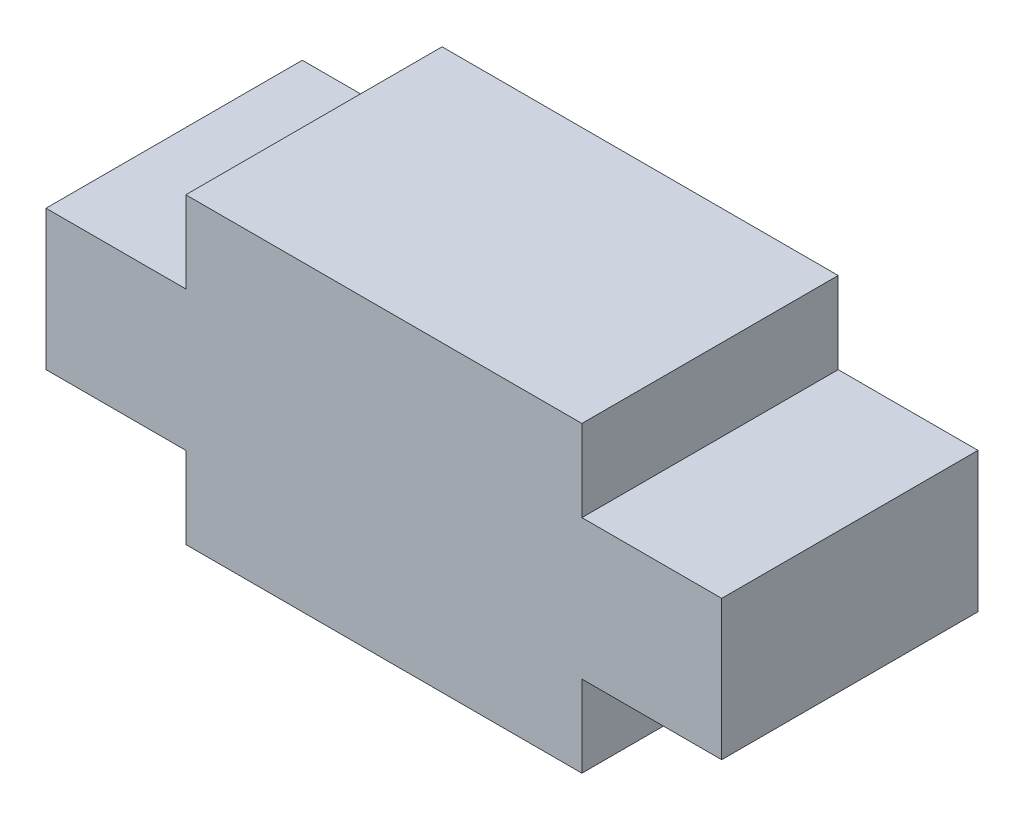
ISO-10303-21;
HEADER;
FILE_DESCRIPTION(('STEP AP214'),'2;1');
FILE_NAME('part.step','',(''),(''),'','','');
FILE_SCHEMA(('AUTOMOTIVE_DESIGN { 1 0 10303 214 1 1 1 1 }'));
ENDSEC;
DATA;
#1=APPLICATION_CONTEXT('core data for automotive mechanical design processes');
#2=APPLICATION_PROTOCOL_DEFINITION('international standard','automotive_design',2000,#1);
#3=PRODUCT_CONTEXT('',#1,'mechanical');
#4=PRODUCT('Part','Part','',(#3));
#5=PRODUCT_RELATED_PRODUCT_CATEGORY('part','',(#4));
#6=PRODUCT_DEFINITION_FORMATION('','',#4);
#7=PRODUCT_DEFINITION_CONTEXT('part definition',#1,'design');
#8=PRODUCT_DEFINITION('design','',#6,#7);
#9=PRODUCT_DEFINITION_SHAPE('','',#8);
#10=(LENGTH_UNIT() NAMED_UNIT(*) SI_UNIT(.MILLI.,.METRE.));
#11=(NAMED_UNIT(*) PLANE_ANGLE_UNIT() SI_UNIT($,.RADIAN.));
#12=(NAMED_UNIT(*) SI_UNIT($,.STERADIAN.) SOLID_ANGLE_UNIT());
#13=UNCERTAINTY_MEASURE_WITH_UNIT(LENGTH_MEASURE(1.E-05),#10,'distance_accuracy_value','');
#14=(GEOMETRIC_REPRESENTATION_CONTEXT(3) GLOBAL_UNCERTAINTY_ASSIGNED_CONTEXT((#13)) GLOBAL_UNIT_ASSIGNED_CONTEXT((#10,
#11,#12)) REPRESENTATION_CONTEXT('',''));
#15=CARTESIAN_POINT('',(0.,0.,0.));
#16=DIRECTION('',(0.,0.,1.));
#17=DIRECTION('',(1.,0.,0.));
#18=AXIS2_PLACEMENT_3D('',#15,#16,#17);
#19=CARTESIAN_POINT('',(-1.45,0.3,1.1));
#20=DIRECTION('',(1.,0.,0.));
#21=DIRECTION('',(0.,0.,-1.));
#22=AXIS2_PLACEMENT_3D('',#19,#20,#21);
#23=PLANE('',#22);
#24=DIRECTION('',(0.,-1.,0.));
#25=VECTOR('',#24,1.);
#26=CARTESIAN_POINT('',(-1.45,0.3,0.));
#27=LINE('',#26,#25);
#28=CARTESIAN_POINT('',(-1.45,0.3,0.));
#29=VERTEX_POINT('',#28);
#30=CARTESIAN_POINT('',(-1.45,-0.3,0.));
#31=VERTEX_POINT('',#30);
#32=EDGE_CURVE('E154',#29,#31,#27,.T.);
#33=ORIENTED_EDGE('',*,*,#32,.T.);
#34=DIRECTION('',(0.,0.,-1.));
#35=VECTOR('',#34,1.);
#36=CARTESIAN_POINT('',(-1.45,-0.3,1.1));
#37=LINE('',#36,#35);
#38=CARTESIAN_POINT('',(-1.45,-0.3,1.1));
#39=VERTEX_POINT('',#38);
#40=EDGE_CURVE('E11',#39,#31,#37,.T.);
#41=ORIENTED_EDGE('',*,*,#40,.F.);
#42=DIRECTION('',(0.,-1.,0.));
#43=VECTOR('',#42,1.);
#44=CARTESIAN_POINT('',(-1.45,0.3,1.1));
#45=LINE('',#44,#43);
#46=CARTESIAN_POINT('',(-1.45,0.3,1.1));
#47=VERTEX_POINT('',#46);
#48=EDGE_CURVE('E176',#47,#39,#45,.T.);
#49=ORIENTED_EDGE('',*,*,#48,.F.);
#50=DIRECTION('',(0.,0.,-1.));
#51=VECTOR('',#50,1.);
#52=CARTESIAN_POINT('',(-1.45,0.3,1.1));
#53=LINE('',#52,#51);
#54=EDGE_CURVE('E150',#47,#29,#53,.T.);
#55=ORIENTED_EDGE('',*,*,#54,.T.);
#56=EDGE_LOOP('',(#33,#41,#49,#55));
#57=FACE_BOUND('',#56,.T.);
#58=ADVANCED_FACE('F34',(#57),#23,.F.);
#59=CARTESIAN_POINT('',(-1.45,-0.3,1.1));
#60=DIRECTION('',(0.,1.,0.));
#61=DIRECTION('',(0.,0.,1.));
#62=AXIS2_PLACEMENT_3D('',#59,#60,#61);
#63=PLANE('',#62);
#64=DIRECTION('',(1.,0.,0.));
#65=VECTOR('',#64,1.);
#66=CARTESIAN_POINT('',(-1.45,-0.3,0.));
#67=LINE('',#66,#65);
#68=CARTESIAN_POINT('',(-0.85,-0.3,0.));
#69=VERTEX_POINT('',#68);
#70=EDGE_CURVE('E157',#31,#69,#67,.T.);
#71=ORIENTED_EDGE('',*,*,#70,.T.);
#72=DIRECTION('',(0.,0.,-1.));
#73=VECTOR('',#72,1.);
#74=CARTESIAN_POINT('',(-0.85,-0.3,1.1));
#75=LINE('',#74,#73);
#76=CARTESIAN_POINT('',(-0.85,-0.3,1.1));
#77=VERTEX_POINT('',#76);
#78=EDGE_CURVE('E42',#77,#69,#75,.T.);
#79=ORIENTED_EDGE('',*,*,#78,.F.);
#80=DIRECTION('',(1.,0.,0.));
#81=VECTOR('',#80,1.);
#82=CARTESIAN_POINT('',(-1.45,-0.3,1.1));
#83=LINE('',#82,#81);
#84=EDGE_CURVE('E105',#39,#77,#83,.T.);
#85=ORIENTED_EDGE('',*,*,#84,.F.);
#86=ORIENTED_EDGE('',*,*,#40,.T.);
#87=EDGE_LOOP('',(#71,#79,#85,#86));
#88=FACE_BOUND('',#87,.T.);
#89=ADVANCED_FACE('F254',(#88),#63,.F.);
#90=CARTESIAN_POINT('',(-0.85,-0.3,1.1));
#91=DIRECTION('',(1.,0.,0.));
#92=DIRECTION('',(0.,0.,-1.));
#93=AXIS2_PLACEMENT_3D('',#90,#91,#92);
#94=PLANE('',#93);
#95=DIRECTION('',(0.,-1.,0.));
#96=VECTOR('',#95,1.);
#97=CARTESIAN_POINT('',(-0.85,-0.3,0.));
#98=LINE('',#97,#96);
#99=CARTESIAN_POINT('',(-0.85,-0.65,0.));
#100=VERTEX_POINT('',#99);
#101=EDGE_CURVE('E159',#69,#100,#98,.T.);
#102=ORIENTED_EDGE('',*,*,#101,.T.);
#103=DIRECTION('',(0.,0.,-1.));
#104=VECTOR('',#103,1.);
#105=CARTESIAN_POINT('',(-0.85,-0.65,1.1));
#106=LINE('',#105,#104);
#107=CARTESIAN_POINT('',(-0.85,-0.65,1.1));
#108=VERTEX_POINT('',#107);
#109=EDGE_CURVE('E195',#108,#100,#106,.T.);
#110=ORIENTED_EDGE('',*,*,#109,.F.);
#111=DIRECTION('',(0.,-1.,0.));
#112=VECTOR('',#111,1.);
#113=CARTESIAN_POINT('',(-0.85,-0.3,1.1));
#114=LINE('',#113,#112);
#115=EDGE_CURVE('E203',#77,#108,#114,.T.);
#116=ORIENTED_EDGE('',*,*,#115,.F.);
#117=ORIENTED_EDGE('',*,*,#78,.T.);
#118=EDGE_LOOP('',(#102,#110,#116,#117));
#119=FACE_BOUND('',#118,.T.);
#120=ADVANCED_FACE('F201',(#119),#94,.F.);
#121=CARTESIAN_POINT('',(-0.85,-0.65,1.1));
#122=DIRECTION('',(0.,1.,0.));
#123=DIRECTION('',(0.,0.,1.));
#124=AXIS2_PLACEMENT_3D('',#121,#122,#123);
#125=PLANE('',#124);
#126=DIRECTION('',(1.,0.,0.));
#127=VECTOR('',#126,1.);
#128=CARTESIAN_POINT('',(-0.85,-0.65,0.));
#129=LINE('',#128,#127);
#130=CARTESIAN_POINT('',(0.85,-0.65,0.));
#131=VERTEX_POINT('',#130);
#132=EDGE_CURVE('E161',#100,#131,#129,.T.);
#133=ORIENTED_EDGE('',*,*,#132,.T.);
#134=DIRECTION('',(0.,0.,-1.));
#135=VECTOR('',#134,1.);
#136=CARTESIAN_POINT('',(0.85,-0.65,1.1));
#137=LINE('',#136,#135);
#138=CARTESIAN_POINT('',(0.85,-0.65,1.1));
#139=VERTEX_POINT('',#138);
#140=EDGE_CURVE('E192',#139,#131,#137,.T.);
#141=ORIENTED_EDGE('',*,*,#140,.F.);
#142=DIRECTION('',(1.,0.,0.));
#143=VECTOR('',#142,1.);
#144=CARTESIAN_POINT('',(-0.85,-0.65,1.1));
#145=LINE('',#144,#143);
#146=EDGE_CURVE('E221',#108,#139,#145,.T.);
#147=ORIENTED_EDGE('',*,*,#146,.F.);
#148=ORIENTED_EDGE('',*,*,#109,.T.);
#149=EDGE_LOOP('',(#133,#141,#147,#148));
#150=FACE_BOUND('',#149,.T.);
#151=ADVANCED_FACE('F212',(#150),#125,.F.);
#152=CARTESIAN_POINT('',(0.85,-0.65,1.1));
#153=DIRECTION('',(-1.,0.,0.));
#154=DIRECTION('',(0.,0.,1.));
#155=AXIS2_PLACEMENT_3D('',#152,#153,#154);
#156=PLANE('',#155);
#157=DIRECTION('',(0.,1.,0.));
#158=VECTOR('',#157,1.);
#159=CARTESIAN_POINT('',(0.85,-0.65,0.));
#160=LINE('',#159,#158);
#161=CARTESIAN_POINT('',(0.85,-0.3,0.));
#162=VERTEX_POINT('',#161);
#163=EDGE_CURVE('E163',#131,#162,#160,.T.);
#164=ORIENTED_EDGE('',*,*,#163,.T.);
#165=DIRECTION('',(0.,0.,-1.));
#166=VECTOR('',#165,1.);
#167=CARTESIAN_POINT('',(0.85,-0.3,1.1));
#168=LINE('',#167,#166);
#169=CARTESIAN_POINT('',(0.85,-0.3,1.1));
#170=VERTEX_POINT('',#169);
#171=EDGE_CURVE('E189',#170,#162,#168,.T.);
#172=ORIENTED_EDGE('',*,*,#171,.F.);
#173=DIRECTION('',(0.,1.,0.));
#174=VECTOR('',#173,1.);
#175=CARTESIAN_POINT('',(0.85,-0.65,1.1));
#176=LINE('',#175,#174);
#177=EDGE_CURVE('E218',#139,#170,#176,.T.);
#178=ORIENTED_EDGE('',*,*,#177,.F.);
#179=ORIENTED_EDGE('',*,*,#140,.T.);
#180=EDGE_LOOP('',(#164,#172,#178,#179));
#181=FACE_BOUND('',#180,.T.);
#182=ADVANCED_FACE('F216',(#181),#156,.F.);
#183=CARTESIAN_POINT('',(0.85,-0.3,1.1));
#184=DIRECTION('',(0.,1.,0.));
#185=DIRECTION('',(0.,0.,1.));
#186=AXIS2_PLACEMENT_3D('',#183,#184,#185);
#187=PLANE('',#186);
#188=DIRECTION('',(1.,0.,0.));
#189=VECTOR('',#188,1.);
#190=CARTESIAN_POINT('',(0.85,-0.3,0.));
#191=LINE('',#190,#189);
#192=CARTESIAN_POINT('',(1.45,-0.3,0.));
#193=VERTEX_POINT('',#192);
#194=EDGE_CURVE('E165',#162,#193,#191,.T.);
#195=ORIENTED_EDGE('',*,*,#194,.T.);
#196=DIRECTION('',(0.,0.,-1.));
#197=VECTOR('',#196,1.);
#198=CARTESIAN_POINT('',(1.45,-0.3,1.1));
#199=LINE('',#198,#197);
#200=CARTESIAN_POINT('',(1.45,-0.3,1.1));
#201=VERTEX_POINT('',#200);
#202=EDGE_CURVE('E186',#201,#193,#199,.T.);
#203=ORIENTED_EDGE('',*,*,#202,.F.);
#204=DIRECTION('',(1.,0.,0.));
#205=VECTOR('',#204,1.);
#206=CARTESIAN_POINT('',(0.85,-0.3,1.1));
#207=LINE('',#206,#205);
#208=EDGE_CURVE('E220',#170,#201,#207,.T.);
#209=ORIENTED_EDGE('',*,*,#208,.F.);
#210=ORIENTED_EDGE('',*,*,#171,.T.);
#211=EDGE_LOOP('',(#195,#203,#209,#210));
#212=FACE_BOUND('',#211,.T.);
#213=ADVANCED_FACE('F267',(#212),#187,.F.);
#214=CARTESIAN_POINT('',(1.45,-0.3,1.1));
#215=DIRECTION('',(-1.,0.,0.));
#216=DIRECTION('',(0.,0.,1.));
#217=AXIS2_PLACEMENT_3D('',#214,#215,#216);
#218=PLANE('',#217);
#219=DIRECTION('',(0.,1.,0.));
#220=VECTOR('',#219,1.);
#221=CARTESIAN_POINT('',(1.45,-0.3,0.));
#222=LINE('',#221,#220);
#223=CARTESIAN_POINT('',(1.45,0.3,0.));
#224=VERTEX_POINT('',#223);
#225=EDGE_CURVE('E167',#193,#224,#222,.T.);
#226=ORIENTED_EDGE('',*,*,#225,.T.);
#227=DIRECTION('',(0.,0.,-1.));
#228=VECTOR('',#227,1.);
#229=CARTESIAN_POINT('',(1.45,0.3,1.1));
#230=LINE('',#229,#228);
#231=CARTESIAN_POINT('',(1.45,0.3,1.1));
#232=VERTEX_POINT('',#231);
#233=EDGE_CURVE('E183',#232,#224,#230,.T.);
#234=ORIENTED_EDGE('',*,*,#233,.F.);
#235=DIRECTION('',(0.,1.,0.));
#236=VECTOR('',#235,1.);
#237=CARTESIAN_POINT('',(1.45,-0.3,1.1));
#238=LINE('',#237,#236);
#239=EDGE_CURVE('E223',#201,#232,#238,.T.);
#240=ORIENTED_EDGE('',*,*,#239,.F.);
#241=ORIENTED_EDGE('',*,*,#202,.T.);
#242=EDGE_LOOP('',(#226,#234,#240,#241));
#243=FACE_BOUND('',#242,.T.);
#244=ADVANCED_FACE('F270',(#243),#218,.F.);
#245=CARTESIAN_POINT('',(1.45,0.3,1.1));
#246=DIRECTION('',(0.,-1.,0.));
#247=DIRECTION('',(0.,0.,-1.));
#248=AXIS2_PLACEMENT_3D('',#245,#246,#247);
#249=PLANE('',#248);
#250=DIRECTION('',(-1.,0.,0.));
#251=VECTOR('',#250,1.);
#252=CARTESIAN_POINT('',(1.45,0.3,0.));
#253=LINE('',#252,#251);
#254=CARTESIAN_POINT('',(0.85,0.3,0.));
#255=VERTEX_POINT('',#254);
#256=EDGE_CURVE('E169',#224,#255,#253,.T.);
#257=ORIENTED_EDGE('',*,*,#256,.T.);
#258=DIRECTION('',(0.,0.,-1.));
#259=VECTOR('',#258,1.);
#260=CARTESIAN_POINT('',(0.85,0.3,1.1));
#261=LINE('',#260,#259);
#262=CARTESIAN_POINT('',(0.85,0.3,1.1));
#263=VERTEX_POINT('',#262);
#264=EDGE_CURVE('E180',#263,#255,#261,.T.);
#265=ORIENTED_EDGE('',*,*,#264,.F.);
#266=DIRECTION('',(-1.,0.,0.));
#267=VECTOR('',#266,1.);
#268=CARTESIAN_POINT('',(1.45,0.3,1.1));
#269=LINE('',#268,#267);
#270=EDGE_CURVE('E229',#232,#263,#269,.T.);
#271=ORIENTED_EDGE('',*,*,#270,.F.);
#272=ORIENTED_EDGE('',*,*,#233,.T.);
#273=EDGE_LOOP('',(#257,#265,#271,#272));
#274=FACE_BOUND('',#273,.T.);
#275=ADVANCED_FACE('F235',(#274),#249,.F.);
#276=CARTESIAN_POINT('',(0.85,0.3,1.1));
#277=DIRECTION('',(-1.,0.,0.));
#278=DIRECTION('',(0.,0.,1.));
#279=AXIS2_PLACEMENT_3D('',#276,#277,#278);
#280=PLANE('',#279);
#281=DIRECTION('',(0.,1.,0.));
#282=VECTOR('',#281,1.);
#283=CARTESIAN_POINT('',(0.85,0.3,0.));
#284=LINE('',#283,#282);
#285=CARTESIAN_POINT('',(0.85,0.65,0.));
#286=VERTEX_POINT('',#285);
#287=EDGE_CURVE('E171',#255,#286,#284,.T.);
#288=ORIENTED_EDGE('',*,*,#287,.T.);
#289=DIRECTION('',(0.,0.,-1.));
#290=VECTOR('',#289,1.);
#291=CARTESIAN_POINT('',(0.85,0.65,1.1));
#292=LINE('',#291,#290);
#293=CARTESIAN_POINT('',(0.85,0.65,1.1));
#294=VERTEX_POINT('',#293);
#295=EDGE_CURVE('E145',#294,#286,#292,.T.);
#296=ORIENTED_EDGE('',*,*,#295,.F.);
#297=DIRECTION('',(0.,1.,0.));
#298=VECTOR('',#297,1.);
#299=CARTESIAN_POINT('',(0.85,0.3,1.1));
#300=LINE('',#299,#298);
#301=EDGE_CURVE('E136',#263,#294,#300,.T.);
#302=ORIENTED_EDGE('',*,*,#301,.F.);
#303=ORIENTED_EDGE('',*,*,#264,.T.);
#304=EDGE_LOOP('',(#288,#296,#302,#303));
#305=FACE_BOUND('',#304,.T.);
#306=ADVANCED_FACE('F239',(#305),#280,.F.);
#307=CARTESIAN_POINT('',(0.85,0.65,1.1));
#308=DIRECTION('',(0.,-1.,0.));
#309=DIRECTION('',(0.,0.,-1.));
#310=AXIS2_PLACEMENT_3D('',#307,#308,#309);
#311=PLANE('',#310);
#312=DIRECTION('',(-1.,0.,0.));
#313=VECTOR('',#312,1.);
#314=CARTESIAN_POINT('',(0.85,0.65,0.));
#315=LINE('',#314,#313);
#316=CARTESIAN_POINT('',(-0.85,0.65,0.));
#317=VERTEX_POINT('',#316);
#318=EDGE_CURVE('E144',#286,#317,#315,.T.);
#319=ORIENTED_EDGE('',*,*,#318,.T.);
#320=DIRECTION('',(0.,0.,-1.));
#321=VECTOR('',#320,1.);
#322=CARTESIAN_POINT('',(-0.85,0.65,1.1));
#323=LINE('',#322,#321);
#324=CARTESIAN_POINT('',(-0.85,0.65,1.1));
#325=VERTEX_POINT('',#324);
#326=EDGE_CURVE('E141',#325,#317,#323,.T.);
#327=ORIENTED_EDGE('',*,*,#326,.F.);
#328=DIRECTION('',(-1.,0.,0.));
#329=VECTOR('',#328,1.);
#330=CARTESIAN_POINT('',(0.85,0.65,1.1));
#331=LINE('',#330,#329);
#332=EDGE_CURVE('E130',#294,#325,#331,.T.);
#333=ORIENTED_EDGE('',*,*,#332,.F.);
#334=ORIENTED_EDGE('',*,*,#295,.T.);
#335=EDGE_LOOP('',(#319,#327,#333,#334));
#336=FACE_BOUND('',#335,.T.);
#337=ADVANCED_FACE('F142',(#336),#311,.F.);
#338=CARTESIAN_POINT('',(-0.85,0.65,1.1));
#339=DIRECTION('',(1.,0.,0.));
#340=DIRECTION('',(0.,0.,-1.));
#341=AXIS2_PLACEMENT_3D('',#338,#339,#340);
#342=PLANE('',#341);
#343=DIRECTION('',(0.,-1.,0.));
#344=VECTOR('',#343,1.);
#345=CARTESIAN_POINT('',(-0.85,0.65,0.));
#346=LINE('',#345,#344);
#347=CARTESIAN_POINT('',(-0.85,0.3,0.));
#348=VERTEX_POINT('',#347);
#349=EDGE_CURVE('E91',#317,#348,#346,.T.);
#350=ORIENTED_EDGE('',*,*,#349,.T.);
#351=DIRECTION('',(0.,0.,-1.));
#352=VECTOR('',#351,1.);
#353=CARTESIAN_POINT('',(-0.85,0.3,1.1));
#354=LINE('',#353,#352);
#355=CARTESIAN_POINT('',(-0.85,0.3,1.1));
#356=VERTEX_POINT('',#355);
#357=EDGE_CURVE('E146',#356,#348,#354,.T.);
#358=ORIENTED_EDGE('',*,*,#357,.F.);
#359=DIRECTION('',(0.,-1.,0.));
#360=VECTOR('',#359,1.);
#361=CARTESIAN_POINT('',(-0.85,0.65,1.1));
#362=LINE('',#361,#360);
#363=EDGE_CURVE('E134',#325,#356,#362,.T.);
#364=ORIENTED_EDGE('',*,*,#363,.F.);
#365=ORIENTED_EDGE('',*,*,#326,.T.);
#366=EDGE_LOOP('',(#350,#358,#364,#365));
#367=FACE_BOUND('',#366,.T.);
#368=ADVANCED_FACE('F148',(#367),#342,.F.);
#369=CARTESIAN_POINT('',(-0.85,0.3,1.1));
#370=DIRECTION('',(0.,-1.,0.));
#371=DIRECTION('',(0.,0.,-1.));
#372=AXIS2_PLACEMENT_3D('',#369,#370,#371);
#373=PLANE('',#372);
#374=DIRECTION('',(-1.,0.,0.));
#375=VECTOR('',#374,1.);
#376=CARTESIAN_POINT('',(-0.85,0.3,0.));
#377=LINE('',#376,#375);
#378=EDGE_CURVE('E97',#348,#29,#377,.T.);
#379=ORIENTED_EDGE('',*,*,#378,.T.);
#380=ORIENTED_EDGE('',*,*,#54,.F.);
#381=DIRECTION('',(-1.,0.,0.));
#382=VECTOR('',#381,1.);
#383=CARTESIAN_POINT('',(-0.85,0.3,1.1));
#384=LINE('',#383,#382);
#385=EDGE_CURVE('E50',#356,#47,#384,.T.);
#386=ORIENTED_EDGE('',*,*,#385,.F.);
#387=ORIENTED_EDGE('',*,*,#357,.T.);
#388=EDGE_LOOP('',(#379,#380,#386,#387));
#389=FACE_BOUND('',#388,.T.);
#390=ADVANCED_FACE('F243',(#389),#373,.F.);
#391=CARTESIAN_POINT('',(0.,0.,1.1));
#392=DIRECTION('',(0.,0.,1.));
#393=DIRECTION('',(1.,0.,0.));
#394=AXIS2_PLACEMENT_3D('',#391,#392,#393);
#395=PLANE('',#394);
#396=ORIENTED_EDGE('',*,*,#48,.T.);
#397=ORIENTED_EDGE('',*,*,#84,.T.);
#398=ORIENTED_EDGE('',*,*,#115,.T.);
#399=ORIENTED_EDGE('',*,*,#146,.T.);
#400=ORIENTED_EDGE('',*,*,#177,.T.);
#401=ORIENTED_EDGE('',*,*,#208,.T.);
#402=ORIENTED_EDGE('',*,*,#239,.T.);
#403=ORIENTED_EDGE('',*,*,#270,.T.);
#404=ORIENTED_EDGE('',*,*,#301,.T.);
#405=ORIENTED_EDGE('',*,*,#332,.T.);
#406=ORIENTED_EDGE('',*,*,#363,.T.);
#407=ORIENTED_EDGE('',*,*,#385,.T.);
#408=EDGE_LOOP('',(#396,#397,#398,#399,#400,#401,#402,#403,#404,#405,#406,#407));
#409=FACE_BOUND('',#408,.T.);
#410=ADVANCED_FACE('F132',(#409),#395,.T.);
#411=CARTESIAN_POINT('',(0.,0.,0.));
#412=DIRECTION('',(0.,0.,1.));
#413=DIRECTION('',(1.,0.,0.));
#414=AXIS2_PLACEMENT_3D('',#411,#412,#413);
#415=PLANE('',#414);
#416=ORIENTED_EDGE('',*,*,#32,.F.);
#417=ORIENTED_EDGE('',*,*,#378,.F.);
#418=ORIENTED_EDGE('',*,*,#349,.F.);
#419=ORIENTED_EDGE('',*,*,#318,.F.);
#420=ORIENTED_EDGE('',*,*,#287,.F.);
#421=ORIENTED_EDGE('',*,*,#256,.F.);
#422=ORIENTED_EDGE('',*,*,#225,.F.);
#423=ORIENTED_EDGE('',*,*,#194,.F.);
#424=ORIENTED_EDGE('',*,*,#163,.F.);
#425=ORIENTED_EDGE('',*,*,#132,.F.);
#426=ORIENTED_EDGE('',*,*,#101,.F.);
#427=ORIENTED_EDGE('',*,*,#70,.F.);
#428=EDGE_LOOP('',(#416,#417,#418,#419,#420,#421,#422,#423,#424,#425,#426,#427));
#429=FACE_BOUND('',#428,.T.);
#430=ADVANCED_FACE('F207',(#429),#415,.F.);
#431=CLOSED_SHELL('',(#58,#89,#120,#151,#182,#213,#244,#275,#306,#337,#368,#390,#410,#430));
#432=MANIFOLD_SOLID_BREP('B2',#431);
#433=ADVANCED_BREP_SHAPE_REPRESENTATION('',(#18,#432),#14);
#434=SHAPE_DEFINITION_REPRESENTATION(#9,#433);
ENDSEC;
END-ISO-10303-21;
